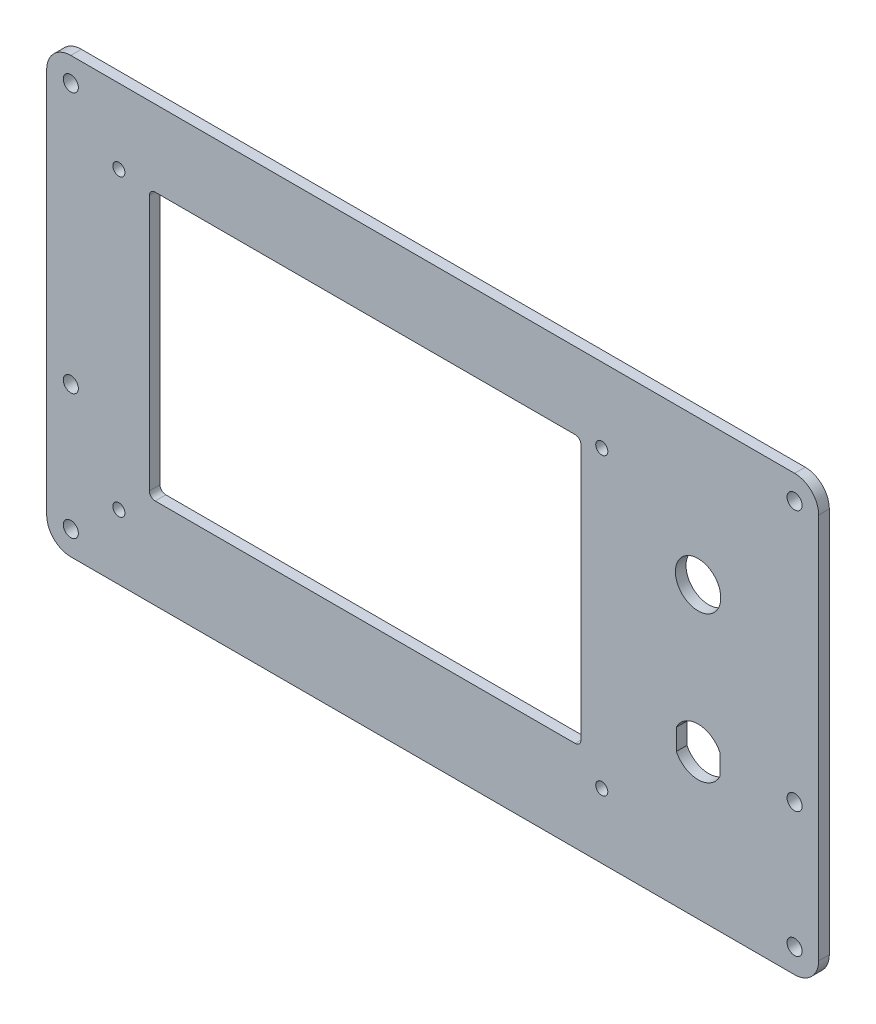
ISO-10303-21;
HEADER;
FILE_DESCRIPTION(('STEP AP214'),'2;1');
FILE_NAME('part.step','',(''),(''),'','','');
FILE_SCHEMA(('AUTOMOTIVE_DESIGN { 1 0 10303 214 1 1 1 1 }'));
ENDSEC;
DATA;
#1=APPLICATION_CONTEXT('core data for automotive mechanical design processes');
#2=APPLICATION_PROTOCOL_DEFINITION('international standard','automotive_design',2000,#1);
#3=PRODUCT_CONTEXT('',#1,'mechanical');
#4=PRODUCT('Part','Part','',(#3));
#5=PRODUCT_RELATED_PRODUCT_CATEGORY('part','',(#4));
#6=PRODUCT_DEFINITION_FORMATION('','',#4);
#7=PRODUCT_DEFINITION_CONTEXT('part definition',#1,'design');
#8=PRODUCT_DEFINITION('design','',#6,#7);
#9=PRODUCT_DEFINITION_SHAPE('','',#8);
#10=(LENGTH_UNIT() NAMED_UNIT(*) SI_UNIT(.MILLI.,.METRE.));
#11=(NAMED_UNIT(*) PLANE_ANGLE_UNIT() SI_UNIT($,.RADIAN.));
#12=(NAMED_UNIT(*) SI_UNIT($,.STERADIAN.) SOLID_ANGLE_UNIT());
#13=UNCERTAINTY_MEASURE_WITH_UNIT(LENGTH_MEASURE(1.E-05),#10,'distance_accuracy_value','');
#14=(GEOMETRIC_REPRESENTATION_CONTEXT(3) GLOBAL_UNCERTAINTY_ASSIGNED_CONTEXT((#13)) GLOBAL_UNIT_ASSIGNED_CONTEXT((#10,
#11,#12)) REPRESENTATION_CONTEXT('',''));
#15=CARTESIAN_POINT('',(0.,0.,0.));
#16=DIRECTION('',(0.,0.,1.));
#17=DIRECTION('',(1.,0.,0.));
#18=AXIS2_PLACEMENT_3D('',#15,#16,#17);
#19=CARTESIAN_POINT('',(101.6,-57.15,2.794));
#20=DIRECTION('',(-1.,0.,0.));
#21=DIRECTION('',(0.,0.,1.));
#22=AXIS2_PLACEMENT_3D('',#19,#20,#21);
#23=PLANE('',#22);
#24=DIRECTION('',(0.,1.,0.));
#25=VECTOR('',#24,1.);
#26=CARTESIAN_POINT('',(101.6,-57.15,2.794));
#27=LINE('',#26,#25);
#28=CARTESIAN_POINT('',(101.6,-50.8,2.794));
#29=VERTEX_POINT('',#28);
#30=CARTESIAN_POINT('',(101.6,50.8,2.794));
#31=VERTEX_POINT('',#30);
#32=EDGE_CURVE('E295',#29,#31,#27,.T.);
#33=ORIENTED_EDGE('',*,*,#32,.F.);
#34=DIRECTION('',(0.,0.,-1.));
#35=VECTOR('',#34,1.);
#36=CARTESIAN_POINT('',(101.6,-50.8,2.794));
#37=LINE('',#36,#35);
#38=CARTESIAN_POINT('',(101.6,-50.8,0.));
#39=VERTEX_POINT('',#38);
#40=EDGE_CURVE('E382',#29,#39,#37,.T.);
#41=ORIENTED_EDGE('',*,*,#40,.T.);
#42=DIRECTION('',(0.,1.,0.));
#43=VECTOR('',#42,1.);
#44=CARTESIAN_POINT('',(101.6,-57.15,0.));
#45=LINE('',#44,#43);
#46=CARTESIAN_POINT('',(101.6,50.8,0.));
#47=VERTEX_POINT('',#46);
#48=EDGE_CURVE('E294',#39,#47,#45,.T.);
#49=ORIENTED_EDGE('',*,*,#48,.T.);
#50=DIRECTION('',(0.,0.,-1.));
#51=VECTOR('',#50,1.);
#52=CARTESIAN_POINT('',(101.6,50.8,2.794));
#53=LINE('',#52,#51);
#54=EDGE_CURVE('E380',#47,#31,#53,.F.);
#55=ORIENTED_EDGE('',*,*,#54,.T.);
#56=EDGE_LOOP('',(#33,#41,#49,#55));
#57=FACE_BOUND('',#56,.T.);
#58=ADVANCED_FACE('F33',(#57),#23,.F.);
#59=CARTESIAN_POINT('',(-101.6,57.15,2.794));
#60=DIRECTION('',(0.,-1.,0.));
#61=DIRECTION('',(0.,0.,-1.));
#62=AXIS2_PLACEMENT_3D('',#59,#60,#61);
#63=PLANE('',#62);
#64=DIRECTION('',(-1.,0.,0.));
#65=VECTOR('',#64,1.);
#66=CARTESIAN_POINT('',(-101.6,57.15,2.794));
#67=LINE('',#66,#65);
#68=CARTESIAN_POINT('',(95.25,57.15,2.794));
#69=VERTEX_POINT('',#68);
#70=CARTESIAN_POINT('',(-95.25,57.15,2.794));
#71=VERTEX_POINT('',#70);
#72=EDGE_CURVE('E298',#69,#71,#67,.T.);
#73=ORIENTED_EDGE('',*,*,#72,.F.);
#74=DIRECTION('',(0.,0.,-1.));
#75=VECTOR('',#74,1.);
#76=CARTESIAN_POINT('',(95.25,57.15,2.794));
#77=LINE('',#76,#75);
#78=CARTESIAN_POINT('',(95.25,57.15,0.));
#79=VERTEX_POINT('',#78);
#80=EDGE_CURVE('E11',#69,#79,#77,.T.);
#81=ORIENTED_EDGE('',*,*,#80,.T.);
#82=DIRECTION('',(-1.,0.,0.));
#83=VECTOR('',#82,1.);
#84=CARTESIAN_POINT('',(-101.6,57.15,0.));
#85=LINE('',#84,#83);
#86=CARTESIAN_POINT('',(-95.25,57.15,0.));
#87=VERTEX_POINT('',#86);
#88=EDGE_CURVE('E311',#79,#87,#85,.T.);
#89=ORIENTED_EDGE('',*,*,#88,.T.);
#90=DIRECTION('',(0.,0.,-1.));
#91=VECTOR('',#90,1.);
#92=CARTESIAN_POINT('',(-95.25,57.15,2.794));
#93=LINE('',#92,#91);
#94=EDGE_CURVE('E41',#87,#71,#93,.F.);
#95=ORIENTED_EDGE('',*,*,#94,.T.);
#96=EDGE_LOOP('',(#73,#81,#89,#95));
#97=FACE_BOUND('',#96,.T.);
#98=ADVANCED_FACE('F387',(#97),#63,.F.);
#99=CARTESIAN_POINT('',(-101.6,-57.15,2.794));
#100=DIRECTION('',(1.,0.,0.));
#101=DIRECTION('',(0.,0.,-1.));
#102=AXIS2_PLACEMENT_3D('',#99,#100,#101);
#103=PLANE('',#102);
#104=DIRECTION('',(0.,-1.,0.));
#105=VECTOR('',#104,1.);
#106=CARTESIAN_POINT('',(-101.6,-57.15,0.));
#107=LINE('',#106,#105);
#108=CARTESIAN_POINT('',(-101.6,50.8,0.));
#109=VERTEX_POINT('',#108);
#110=CARTESIAN_POINT('',(-101.6,-50.8,0.));
#111=VERTEX_POINT('',#110);
#112=EDGE_CURVE('E314',#109,#111,#107,.T.);
#113=ORIENTED_EDGE('',*,*,#112,.T.);
#114=DIRECTION('',(0.,0.,-1.));
#115=VECTOR('',#114,1.);
#116=CARTESIAN_POINT('',(-101.6,-50.8,2.794));
#117=LINE('',#116,#115);
#118=CARTESIAN_POINT('',(-101.6,-50.8,2.794));
#119=VERTEX_POINT('',#118);
#120=EDGE_CURVE('E370',#111,#119,#117,.F.);
#121=ORIENTED_EDGE('',*,*,#120,.T.);
#122=DIRECTION('',(0.,-1.,0.));
#123=VECTOR('',#122,1.);
#124=CARTESIAN_POINT('',(-101.6,-57.15,2.794));
#125=LINE('',#124,#123);
#126=CARTESIAN_POINT('',(-101.6,50.8,2.794));
#127=VERTEX_POINT('',#126);
#128=EDGE_CURVE('E302',#127,#119,#125,.T.);
#129=ORIENTED_EDGE('',*,*,#128,.F.);
#130=DIRECTION('',(0.,0.,-1.));
#131=VECTOR('',#130,1.);
#132=CARTESIAN_POINT('',(-101.6,50.8,2.794));
#133=LINE('',#132,#131);
#134=EDGE_CURVE('E367',#127,#109,#133,.T.);
#135=ORIENTED_EDGE('',*,*,#134,.T.);
#136=EDGE_LOOP('',(#113,#121,#129,#135));
#137=FACE_BOUND('',#136,.T.);
#138=ADVANCED_FACE('F399',(#137),#103,.F.);
#139=CARTESIAN_POINT('',(-101.6,-57.15,2.794));
#140=DIRECTION('',(0.,1.,0.));
#141=DIRECTION('',(0.,0.,1.));
#142=AXIS2_PLACEMENT_3D('',#139,#140,#141);
#143=PLANE('',#142);
#144=DIRECTION('',(1.,0.,0.));
#145=VECTOR('',#144,1.);
#146=CARTESIAN_POINT('',(-101.6,-57.15,2.794));
#147=LINE('',#146,#145);
#148=CARTESIAN_POINT('',(-95.25,-57.15,2.794));
#149=VERTEX_POINT('',#148);
#150=CARTESIAN_POINT('',(95.25,-57.15,2.794));
#151=VERTEX_POINT('',#150);
#152=EDGE_CURVE('E305',#149,#151,#147,.T.);
#153=ORIENTED_EDGE('',*,*,#152,.F.);
#154=DIRECTION('',(0.,0.,-1.));
#155=VECTOR('',#154,1.);
#156=CARTESIAN_POINT('',(-95.25,-57.15,2.794));
#157=LINE('',#156,#155);
#158=CARTESIAN_POINT('',(-95.25,-57.15,0.));
#159=VERTEX_POINT('',#158);
#160=EDGE_CURVE('E356',#149,#159,#157,.T.);
#161=ORIENTED_EDGE('',*,*,#160,.T.);
#162=DIRECTION('',(1.,0.,0.));
#163=VECTOR('',#162,1.);
#164=CARTESIAN_POINT('',(-101.6,-57.15,0.));
#165=LINE('',#164,#163);
#166=CARTESIAN_POINT('',(95.25,-57.15,0.));
#167=VERTEX_POINT('',#166);
#168=EDGE_CURVE('E299',#159,#167,#165,.T.);
#169=ORIENTED_EDGE('',*,*,#168,.T.);
#170=DIRECTION('',(0.,0.,-1.));
#171=VECTOR('',#170,1.);
#172=CARTESIAN_POINT('',(95.25,-57.15,2.794));
#173=LINE('',#172,#171);
#174=EDGE_CURVE('E354',#167,#151,#173,.F.);
#175=ORIENTED_EDGE('',*,*,#174,.T.);
#176=EDGE_LOOP('',(#153,#161,#169,#175));
#177=FACE_BOUND('',#176,.T.);
#178=ADVANCED_FACE('F409',(#177),#143,.F.);
#179=CARTESIAN_POINT('',(0.,0.,2.794));
#180=DIRECTION('',(0.,0.,-1.));
#181=DIRECTION('',(-1.,0.,0.));
#182=AXIS2_PLACEMENT_3D('',#179,#180,#181);
#183=PLANE('',#182);
#184=CARTESIAN_POINT('',(69.85,19.05,2.794));
#185=DIRECTION('',(0.,0.,1.));
#186=DIRECTION('',(1.,0.,0.));
#187=AXIS2_PLACEMENT_3D('',#184,#185,#186);
#188=CIRCLE('',#187,5.96900000000001);
#189=CARTESIAN_POINT('',(75.819,19.05,2.794));
#190=VERTEX_POINT('',#189);
#191=EDGE_CURVE('E194',#190,#190,#188,.T.);
#192=ORIENTED_EDGE('',*,*,#191,.F.);
#193=EDGE_LOOP('',(#192));
#194=FACE_BOUND('',#193,.T.);
#195=DIRECTION('',(0.,1.,0.));
#196=VECTOR('',#195,1.);
#197=CARTESIAN_POINT('',(75.565,-21.8179008291483,2.794));
#198=LINE('',#197,#196);
#199=CARTESIAN_POINT('',(75.565,-21.8179008291483,2.794));
#200=VERTEX_POINT('',#199);
#201=CARTESIAN_POINT('',(75.565,-16.2820991708517,2.794));
#202=VERTEX_POINT('',#201);
#203=EDGE_CURVE('E200',#200,#202,#198,.T.);
#204=ORIENTED_EDGE('',*,*,#203,.F.);
#205=CARTESIAN_POINT('',(69.85,-19.05,2.794));
#206=DIRECTION('',(0.,0.,1.));
#207=DIRECTION('',(1.,0.,0.));
#208=AXIS2_PLACEMENT_3D('',#205,#206,#207);
#209=CIRCLE('',#208,6.35);
#210=CARTESIAN_POINT('',(64.135,-21.8179008291483,2.794));
#211=VERTEX_POINT('',#210);
#212=EDGE_CURVE('E48',#211,#200,#209,.T.);
#213=ORIENTED_EDGE('',*,*,#212,.F.);
#214=DIRECTION('',(0.,-1.,0.));
#215=VECTOR('',#214,1.);
#216=CARTESIAN_POINT('',(64.135,-21.8179008291483,2.794));
#217=LINE('',#216,#215);
#218=CARTESIAN_POINT('',(64.135,-16.2820991708517,2.794));
#219=VERTEX_POINT('',#218);
#220=EDGE_CURVE('E188',#219,#211,#217,.T.);
#221=ORIENTED_EDGE('',*,*,#220,.F.);
#222=CARTESIAN_POINT('',(69.85,-19.05,2.794));
#223=DIRECTION('',(0.,0.,1.));
#224=DIRECTION('',(1.,0.,0.));
#225=AXIS2_PLACEMENT_3D('',#222,#223,#224);
#226=CIRCLE('',#225,6.35);
#227=EDGE_CURVE('E191',#202,#219,#226,.T.);
#228=ORIENTED_EDGE('',*,*,#227,.F.);
#229=EDGE_LOOP('',(#204,#213,#221,#228));
#230=FACE_BOUND('',#229,.T.);
#231=DIRECTION('',(-1.,0.,0.));
#232=VECTOR('',#231,1.);
#233=CARTESIAN_POINT('',(-74.57399995,37.084,2.794));
#234=LINE('',#233,#232);
#235=CARTESIAN_POINT('',(37.48999995,37.084,2.794));
#236=VERTEX_POINT('',#235);
#237=CARTESIAN_POINT('',(-73.04999995,37.084,2.794));
#238=VERTEX_POINT('',#237);
#239=EDGE_CURVE('E226',#236,#238,#234,.T.);
#240=ORIENTED_EDGE('',*,*,#239,.F.);
#241=CARTESIAN_POINT('',(37.48999995,35.56,2.794));
#242=DIRECTION('',(0.,0.,-1.));
#243=DIRECTION('',(-1.,0.,0.));
#244=AXIS2_PLACEMENT_3D('',#241,#242,#243);
#245=CIRCLE('',#244,1.524);
#246=CARTESIAN_POINT('',(39.01399995,35.56,2.794));
#247=VERTEX_POINT('',#246);
#248=EDGE_CURVE('E346',#236,#247,#245,.T.);
#249=ORIENTED_EDGE('',*,*,#248,.T.);
#250=DIRECTION('',(0.,1.,0.));
#251=VECTOR('',#250,1.);
#252=CARTESIAN_POINT('',(39.01399995,-33.30399994,2.794));
#253=LINE('',#252,#251);
#254=CARTESIAN_POINT('',(39.01399995,-31.77999994,2.794));
#255=VERTEX_POINT('',#254);
#256=EDGE_CURVE('E223',#255,#247,#253,.T.);
#257=ORIENTED_EDGE('',*,*,#256,.F.);
#258=CARTESIAN_POINT('',(37.48999995,-31.77999994,2.794));
#259=DIRECTION('',(0.,0.,-1.));
#260=DIRECTION('',(-1.,0.,0.));
#261=AXIS2_PLACEMENT_3D('',#258,#259,#260);
#262=CIRCLE('',#261,1.524);
#263=CARTESIAN_POINT('',(37.48999995,-33.30399994,2.794));
#264=VERTEX_POINT('',#263);
#265=EDGE_CURVE('E342',#255,#264,#262,.T.);
#266=ORIENTED_EDGE('',*,*,#265,.T.);
#267=DIRECTION('',(1.,0.,0.));
#268=VECTOR('',#267,1.);
#269=CARTESIAN_POINT('',(-74.57399995,-33.30399994,2.794));
#270=LINE('',#269,#268);
#271=CARTESIAN_POINT('',(-73.04999995,-33.30399994,2.794));
#272=VERTEX_POINT('',#271);
#273=EDGE_CURVE('E213',#272,#264,#270,.T.);
#274=ORIENTED_EDGE('',*,*,#273,.F.);
#275=CARTESIAN_POINT('',(-73.04999995,-31.77999994,2.794));
#276=DIRECTION('',(0.,0.,-1.));
#277=DIRECTION('',(-1.,0.,0.));
#278=AXIS2_PLACEMENT_3D('',#275,#276,#277);
#279=CIRCLE('',#278,1.524);
#280=CARTESIAN_POINT('',(-74.57399995,-31.77999994,2.794));
#281=VERTEX_POINT('',#280);
#282=EDGE_CURVE('E338',#272,#281,#279,.T.);
#283=ORIENTED_EDGE('',*,*,#282,.T.);
#284=DIRECTION('',(0.,-1.,0.));
#285=VECTOR('',#284,1.);
#286=CARTESIAN_POINT('',(-74.57399995,-33.30399994,2.794));
#287=LINE('',#286,#285);
#288=CARTESIAN_POINT('',(-74.57399995,35.56,2.794));
#289=VERTEX_POINT('',#288);
#290=EDGE_CURVE('E230',#289,#281,#287,.T.);
#291=ORIENTED_EDGE('',*,*,#290,.F.);
#292=CARTESIAN_POINT('',(-73.04999995,35.56,2.794));
#293=DIRECTION('',(0.,0.,-1.));
#294=DIRECTION('',(-1.,0.,0.));
#295=AXIS2_PLACEMENT_3D('',#292,#293,#294);
#296=CIRCLE('',#295,1.524);
#297=EDGE_CURVE('E350',#289,#238,#296,.T.);
#298=ORIENTED_EDGE('',*,*,#297,.T.);
#299=EDGE_LOOP('',(#240,#249,#257,#266,#274,#283,#291,#298));
#300=FACE_BOUND('',#299,.T.);
#301=CARTESIAN_POINT('',(-95.25,50.8,2.794));
#302=DIRECTION('',(0.,0.,1.));
#303=DIRECTION('',(1.,0.,0.));
#304=AXIS2_PLACEMENT_3D('',#301,#302,#303);
#305=CIRCLE('',#304,1.984375);
#306=CARTESIAN_POINT('',(-93.265625,50.8,2.794));
#307=VERTEX_POINT('',#306);
#308=EDGE_CURVE('E222',#307,#307,#305,.T.);
#309=ORIENTED_EDGE('',*,*,#308,.F.);
#310=EDGE_LOOP('',(#309));
#311=FACE_BOUND('',#310,.T.);
#312=CARTESIAN_POINT('',(95.25,50.8,2.794));
#313=DIRECTION('',(0.,0.,1.));
#314=DIRECTION('',(1.,0.,0.));
#315=AXIS2_PLACEMENT_3D('',#312,#313,#314);
#316=CIRCLE('',#315,1.984375);
#317=CARTESIAN_POINT('',(97.234375,50.8,2.794));
#318=VERTEX_POINT('',#317);
#319=EDGE_CURVE('E240',#318,#318,#316,.T.);
#320=ORIENTED_EDGE('',*,*,#319,.F.);
#321=EDGE_LOOP('',(#320));
#322=FACE_BOUND('',#321,.T.);
#323=CARTESIAN_POINT('',(95.25,-50.8,2.794));
#324=DIRECTION('',(0.,0.,1.));
#325=DIRECTION('',(1.,0.,0.));
#326=AXIS2_PLACEMENT_3D('',#323,#324,#325);
#327=CIRCLE('',#326,1.984375);
#328=CARTESIAN_POINT('',(97.234375,-50.8,2.794));
#329=VERTEX_POINT('',#328);
#330=EDGE_CURVE('E246',#329,#329,#327,.T.);
#331=ORIENTED_EDGE('',*,*,#330,.F.);
#332=EDGE_LOOP('',(#331));
#333=FACE_BOUND('',#332,.T.);
#334=CARTESIAN_POINT('',(-95.25,-50.8,2.794));
#335=DIRECTION('',(0.,0.,1.));
#336=DIRECTION('',(1.,0.,0.));
#337=AXIS2_PLACEMENT_3D('',#334,#335,#336);
#338=CIRCLE('',#337,1.984375);
#339=CARTESIAN_POINT('',(-93.265625,-50.8,2.794));
#340=VERTEX_POINT('',#339);
#341=EDGE_CURVE('E252',#340,#340,#338,.T.);
#342=ORIENTED_EDGE('',*,*,#341,.F.);
#343=EDGE_LOOP('',(#342));
#344=FACE_BOUND('',#343,.T.);
#345=CARTESIAN_POINT('',(-95.25,-17.78,2.794));
#346=DIRECTION('',(0.,0.,1.));
#347=DIRECTION('',(1.,0.,0.));
#348=AXIS2_PLACEMENT_3D('',#345,#346,#347);
#349=CIRCLE('',#348,1.984375);
#350=CARTESIAN_POINT('',(-93.265625,-17.78,2.794));
#351=VERTEX_POINT('',#350);
#352=EDGE_CURVE('E258',#351,#351,#349,.T.);
#353=ORIENTED_EDGE('',*,*,#352,.F.);
#354=EDGE_LOOP('',(#353));
#355=FACE_BOUND('',#354,.T.);
#356=CARTESIAN_POINT('',(95.25,-17.78,2.794));
#357=DIRECTION('',(0.,0.,1.));
#358=DIRECTION('',(1.,0.,0.));
#359=AXIS2_PLACEMENT_3D('',#356,#357,#358);
#360=CIRCLE('',#359,1.984375);
#361=CARTESIAN_POINT('',(97.234375,-17.78,2.794));
#362=VERTEX_POINT('',#361);
#363=EDGE_CURVE('E264',#362,#362,#360,.T.);
#364=ORIENTED_EDGE('',*,*,#363,.F.);
#365=EDGE_LOOP('',(#364));
#366=FACE_BOUND('',#365,.T.);
#367=CARTESIAN_POINT('',(-82.6,-40.07,2.794));
#368=DIRECTION('',(0.,0.,1.));
#369=DIRECTION('',(1.,0.,0.));
#370=AXIS2_PLACEMENT_3D('',#367,#368,#369);
#371=CIRCLE('',#370,1.58749999999999);
#372=CARTESIAN_POINT('',(-81.0125,-40.07,2.794));
#373=VERTEX_POINT('',#372);
#374=EDGE_CURVE('E270',#373,#373,#371,.T.);
#375=ORIENTED_EDGE('',*,*,#374,.F.);
#376=EDGE_LOOP('',(#375));
#377=FACE_BOUND('',#376,.T.);
#378=CARTESIAN_POINT('',(-82.6,37.53,2.794));
#379=DIRECTION('',(0.,0.,1.));
#380=DIRECTION('',(1.,0.,0.));
#381=AXIS2_PLACEMENT_3D('',#378,#379,#380);
#382=CIRCLE('',#381,1.58749999999999);
#383=CARTESIAN_POINT('',(-81.0125,37.53,2.794));
#384=VERTEX_POINT('',#383);
#385=EDGE_CURVE('E276',#384,#384,#382,.T.);
#386=ORIENTED_EDGE('',*,*,#385,.F.);
#387=EDGE_LOOP('',(#386));
#388=FACE_BOUND('',#387,.T.);
#389=CARTESIAN_POINT('',(44.5,-40.07,2.794));
#390=DIRECTION('',(0.,0.,1.));
#391=DIRECTION('',(1.,0.,0.));
#392=AXIS2_PLACEMENT_3D('',#389,#390,#391);
#393=CIRCLE('',#392,1.5875);
#394=CARTESIAN_POINT('',(46.0875,-40.07,2.794));
#395=VERTEX_POINT('',#394);
#396=EDGE_CURVE('E282',#395,#395,#393,.T.);
#397=ORIENTED_EDGE('',*,*,#396,.F.);
#398=EDGE_LOOP('',(#397));
#399=FACE_BOUND('',#398,.T.);
#400=CARTESIAN_POINT('',(44.5,37.53,2.794));
#401=DIRECTION('',(0.,0.,1.));
#402=DIRECTION('',(1.,0.,0.));
#403=AXIS2_PLACEMENT_3D('',#400,#401,#402);
#404=CIRCLE('',#403,1.5875);
#405=CARTESIAN_POINT('',(46.0875,37.53,2.794));
#406=VERTEX_POINT('',#405);
#407=EDGE_CURVE('E288',#406,#406,#404,.T.);
#408=ORIENTED_EDGE('',*,*,#407,.F.);
#409=EDGE_LOOP('',(#408));
#410=FACE_BOUND('',#409,.T.);
#411=ORIENTED_EDGE('',*,*,#128,.T.);
#412=CARTESIAN_POINT('',(-95.25,-50.8,2.794));
#413=DIRECTION('',(0.,0.,-1.));
#414=DIRECTION('',(-1.,0.,0.));
#415=AXIS2_PLACEMENT_3D('',#412,#413,#414);
#416=CIRCLE('',#415,6.35);
#417=EDGE_CURVE('E378',#119,#149,#416,.F.);
#418=ORIENTED_EDGE('',*,*,#417,.T.);
#419=ORIENTED_EDGE('',*,*,#152,.T.);
#420=CARTESIAN_POINT('',(95.25,-50.8,2.794));
#421=DIRECTION('',(0.,0.,-1.));
#422=DIRECTION('',(-1.,0.,0.));
#423=AXIS2_PLACEMENT_3D('',#420,#421,#422);
#424=CIRCLE('',#423,6.35);
#425=EDGE_CURVE('E376',#151,#29,#424,.F.);
#426=ORIENTED_EDGE('',*,*,#425,.T.);
#427=ORIENTED_EDGE('',*,*,#32,.T.);
#428=CARTESIAN_POINT('',(95.25,50.8,2.794));
#429=DIRECTION('',(0.,0.,-1.));
#430=DIRECTION('',(-1.,0.,0.));
#431=AXIS2_PLACEMENT_3D('',#428,#429,#430);
#432=CIRCLE('',#431,6.35);
#433=EDGE_CURVE('E374',#31,#69,#432,.F.);
#434=ORIENTED_EDGE('',*,*,#433,.T.);
#435=ORIENTED_EDGE('',*,*,#72,.T.);
#436=CARTESIAN_POINT('',(-95.25,50.8,2.794));
#437=DIRECTION('',(0.,0.,-1.));
#438=DIRECTION('',(-1.,0.,0.));
#439=AXIS2_PLACEMENT_3D('',#436,#437,#438);
#440=CIRCLE('',#439,6.35);
#441=EDGE_CURVE('E372',#71,#127,#440,.F.);
#442=ORIENTED_EDGE('',*,*,#441,.T.);
#443=EDGE_LOOP('',(#411,#418,#419,#426,#427,#434,#435,#442));
#444=FACE_BOUND('',#443,.T.);
#445=ADVANCED_FACE('F393',(#194,#230,#300,#311,#322,#333,#344,#355,#366,#377,#388,#399,#410,
#444),#183,.F.);
#446=CARTESIAN_POINT('',(0.,0.,0.));
#447=DIRECTION('',(0.,0.,-1.));
#448=DIRECTION('',(-1.,0.,0.));
#449=AXIS2_PLACEMENT_3D('',#446,#447,#448);
#450=PLANE('',#449);
#451=CARTESIAN_POINT('',(69.85,19.05,0.));
#452=DIRECTION('',(0.,0.,1.));
#453=DIRECTION('',(1.,0.,0.));
#454=AXIS2_PLACEMENT_3D('',#451,#452,#453);
#455=CIRCLE('',#454,5.96900000000001);
#456=CARTESIAN_POINT('',(75.819,19.05,0.));
#457=VERTEX_POINT('',#456);
#458=EDGE_CURVE('E227',#457,#457,#455,.T.);
#459=ORIENTED_EDGE('',*,*,#458,.T.);
#460=EDGE_LOOP('',(#459));
#461=FACE_BOUND('',#460,.T.);
#462=CARTESIAN_POINT('',(69.85,-19.05,0.));
#463=DIRECTION('',(0.,0.,1.));
#464=DIRECTION('',(1.,0.,0.));
#465=AXIS2_PLACEMENT_3D('',#462,#463,#464);
#466=CIRCLE('',#465,6.35);
#467=CARTESIAN_POINT('',(64.135,-21.8179008291483,0.));
#468=VERTEX_POINT('',#467);
#469=CARTESIAN_POINT('',(75.565,-21.8179008291483,0.));
#470=VERTEX_POINT('',#469);
#471=EDGE_CURVE('E172',#468,#470,#466,.T.);
#472=ORIENTED_EDGE('',*,*,#471,.T.);
#473=DIRECTION('',(0.,1.,0.));
#474=VECTOR('',#473,1.);
#475=CARTESIAN_POINT('',(75.565,-21.8179008291483,0.));
#476=LINE('',#475,#474);
#477=CARTESIAN_POINT('',(75.565,-16.2820991708517,0.));
#478=VERTEX_POINT('',#477);
#479=EDGE_CURVE('E181',#470,#478,#476,.T.);
#480=ORIENTED_EDGE('',*,*,#479,.T.);
#481=CARTESIAN_POINT('',(69.85,-19.05,0.));
#482=DIRECTION('',(0.,0.,1.));
#483=DIRECTION('',(1.,0.,0.));
#484=AXIS2_PLACEMENT_3D('',#481,#482,#483);
#485=CIRCLE('',#484,6.35);
#486=CARTESIAN_POINT('',(64.135,-16.2820991708517,0.));
#487=VERTEX_POINT('',#486);
#488=EDGE_CURVE('E56',#478,#487,#485,.T.);
#489=ORIENTED_EDGE('',*,*,#488,.T.);
#490=DIRECTION('',(0.,-1.,0.));
#491=VECTOR('',#490,1.);
#492=CARTESIAN_POINT('',(64.135,-21.8179008291483,0.));
#493=LINE('',#492,#491);
#494=EDGE_CURVE('E178',#487,#468,#493,.T.);
#495=ORIENTED_EDGE('',*,*,#494,.T.);
#496=EDGE_LOOP('',(#472,#480,#489,#495));
#497=FACE_BOUND('',#496,.T.);
#498=DIRECTION('',(1.,0.,0.));
#499=VECTOR('',#498,1.);
#500=CARTESIAN_POINT('',(-74.57399995,-33.30399994,0.));
#501=LINE('',#500,#499);
#502=CARTESIAN_POINT('',(-73.04999995,-33.30399994,0.));
#503=VERTEX_POINT('',#502);
#504=CARTESIAN_POINT('',(37.48999995,-33.30399994,0.));
#505=VERTEX_POINT('',#504);
#506=EDGE_CURVE('E219',#503,#505,#501,.T.);
#507=ORIENTED_EDGE('',*,*,#506,.T.);
#508=CARTESIAN_POINT('',(37.48999995,-31.77999994,0.));
#509=DIRECTION('',(0.,0.,-1.));
#510=DIRECTION('',(-1.,0.,0.));
#511=AXIS2_PLACEMENT_3D('',#508,#509,#510);
#512=CIRCLE('',#511,1.524);
#513=CARTESIAN_POINT('',(39.01399995,-31.77999994,0.));
#514=VERTEX_POINT('',#513);
#515=EDGE_CURVE('E344',#505,#514,#512,.F.);
#516=ORIENTED_EDGE('',*,*,#515,.T.);
#517=DIRECTION('',(0.,1.,0.));
#518=VECTOR('',#517,1.);
#519=CARTESIAN_POINT('',(39.01399995,-33.30399994,0.));
#520=LINE('',#519,#518);
#521=CARTESIAN_POINT('',(39.01399995,35.56,0.));
#522=VERTEX_POINT('',#521);
#523=EDGE_CURVE('E209',#514,#522,#520,.T.);
#524=ORIENTED_EDGE('',*,*,#523,.T.);
#525=CARTESIAN_POINT('',(37.48999995,35.56,0.));
#526=DIRECTION('',(0.,0.,-1.));
#527=DIRECTION('',(-1.,0.,0.));
#528=AXIS2_PLACEMENT_3D('',#525,#526,#527);
#529=CIRCLE('',#528,1.524);
#530=CARTESIAN_POINT('',(37.48999995,37.084,0.));
#531=VERTEX_POINT('',#530);
#532=EDGE_CURVE('E348',#522,#531,#529,.F.);
#533=ORIENTED_EDGE('',*,*,#532,.T.);
#534=DIRECTION('',(-1.,0.,0.));
#535=VECTOR('',#534,1.);
#536=CARTESIAN_POINT('',(-74.57399995,37.084,0.));
#537=LINE('',#536,#535);
#538=CARTESIAN_POINT('',(-73.04999995,37.084,0.));
#539=VERTEX_POINT('',#538);
#540=EDGE_CURVE('E212',#531,#539,#537,.T.);
#541=ORIENTED_EDGE('',*,*,#540,.T.);
#542=CARTESIAN_POINT('',(-73.04999995,35.56,0.));
#543=DIRECTION('',(0.,0.,-1.));
#544=DIRECTION('',(-1.,0.,0.));
#545=AXIS2_PLACEMENT_3D('',#542,#543,#544);
#546=CIRCLE('',#545,1.524);
#547=CARTESIAN_POINT('',(-74.57399995,35.56,0.));
#548=VERTEX_POINT('',#547);
#549=EDGE_CURVE('E352',#539,#548,#546,.F.);
#550=ORIENTED_EDGE('',*,*,#549,.T.);
#551=DIRECTION('',(0.,-1.,0.));
#552=VECTOR('',#551,1.);
#553=CARTESIAN_POINT('',(-74.57399995,-33.30399994,0.));
#554=LINE('',#553,#552);
#555=CARTESIAN_POINT('',(-74.57399995,-31.77999994,0.));
#556=VERTEX_POINT('',#555);
#557=EDGE_CURVE('E216',#548,#556,#554,.T.);
#558=ORIENTED_EDGE('',*,*,#557,.T.);
#559=CARTESIAN_POINT('',(-73.04999995,-31.77999994,0.));
#560=DIRECTION('',(0.,0.,-1.));
#561=DIRECTION('',(-1.,0.,0.));
#562=AXIS2_PLACEMENT_3D('',#559,#560,#561);
#563=CIRCLE('',#562,1.524);
#564=EDGE_CURVE('E340',#556,#503,#563,.F.);
#565=ORIENTED_EDGE('',*,*,#564,.T.);
#566=EDGE_LOOP('',(#507,#516,#524,#533,#541,#550,#558,#565));
#567=FACE_BOUND('',#566,.T.);
#568=CARTESIAN_POINT('',(-95.25,50.8,0.));
#569=DIRECTION('',(0.,0.,1.));
#570=DIRECTION('',(1.,0.,0.));
#571=AXIS2_PLACEMENT_3D('',#568,#569,#570);
#572=CIRCLE('',#571,1.984375);
#573=CARTESIAN_POINT('',(-93.265625,50.8,0.));
#574=VERTEX_POINT('',#573);
#575=EDGE_CURVE('E237',#574,#574,#572,.T.);
#576=ORIENTED_EDGE('',*,*,#575,.T.);
#577=EDGE_LOOP('',(#576));
#578=FACE_BOUND('',#577,.T.);
#579=CARTESIAN_POINT('',(95.25,50.8,0.));
#580=DIRECTION('',(0.,0.,1.));
#581=DIRECTION('',(1.,0.,0.));
#582=AXIS2_PLACEMENT_3D('',#579,#580,#581);
#583=CIRCLE('',#582,1.984375);
#584=CARTESIAN_POINT('',(97.234375,50.8,0.));
#585=VERTEX_POINT('',#584);
#586=EDGE_CURVE('E243',#585,#585,#583,.T.);
#587=ORIENTED_EDGE('',*,*,#586,.T.);
#588=EDGE_LOOP('',(#587));
#589=FACE_BOUND('',#588,.T.);
#590=CARTESIAN_POINT('',(95.25,-50.8,0.));
#591=DIRECTION('',(0.,0.,1.));
#592=DIRECTION('',(1.,0.,0.));
#593=AXIS2_PLACEMENT_3D('',#590,#591,#592);
#594=CIRCLE('',#593,1.984375);
#595=CARTESIAN_POINT('',(97.234375,-50.8,0.));
#596=VERTEX_POINT('',#595);
#597=EDGE_CURVE('E249',#596,#596,#594,.T.);
#598=ORIENTED_EDGE('',*,*,#597,.T.);
#599=EDGE_LOOP('',(#598));
#600=FACE_BOUND('',#599,.T.);
#601=CARTESIAN_POINT('',(-95.25,-50.8,0.));
#602=DIRECTION('',(0.,0.,1.));
#603=DIRECTION('',(1.,0.,0.));
#604=AXIS2_PLACEMENT_3D('',#601,#602,#603);
#605=CIRCLE('',#604,1.984375);
#606=CARTESIAN_POINT('',(-93.265625,-50.8,0.));
#607=VERTEX_POINT('',#606);
#608=EDGE_CURVE('E255',#607,#607,#605,.T.);
#609=ORIENTED_EDGE('',*,*,#608,.T.);
#610=EDGE_LOOP('',(#609));
#611=FACE_BOUND('',#610,.T.);
#612=CARTESIAN_POINT('',(-95.25,-17.78,0.));
#613=DIRECTION('',(0.,0.,1.));
#614=DIRECTION('',(1.,0.,0.));
#615=AXIS2_PLACEMENT_3D('',#612,#613,#614);
#616=CIRCLE('',#615,1.984375);
#617=CARTESIAN_POINT('',(-93.265625,-17.78,0.));
#618=VERTEX_POINT('',#617);
#619=EDGE_CURVE('E261',#618,#618,#616,.T.);
#620=ORIENTED_EDGE('',*,*,#619,.T.);
#621=EDGE_LOOP('',(#620));
#622=FACE_BOUND('',#621,.T.);
#623=CARTESIAN_POINT('',(95.25,-17.78,0.));
#624=DIRECTION('',(0.,0.,1.));
#625=DIRECTION('',(1.,0.,0.));
#626=AXIS2_PLACEMENT_3D('',#623,#624,#625);
#627=CIRCLE('',#626,1.984375);
#628=CARTESIAN_POINT('',(97.234375,-17.78,0.));
#629=VERTEX_POINT('',#628);
#630=EDGE_CURVE('E267',#629,#629,#627,.T.);
#631=ORIENTED_EDGE('',*,*,#630,.T.);
#632=EDGE_LOOP('',(#631));
#633=FACE_BOUND('',#632,.T.);
#634=CARTESIAN_POINT('',(-82.6,-40.07,0.));
#635=DIRECTION('',(0.,0.,1.));
#636=DIRECTION('',(1.,0.,0.));
#637=AXIS2_PLACEMENT_3D('',#634,#635,#636);
#638=CIRCLE('',#637,1.58749999999999);
#639=CARTESIAN_POINT('',(-81.0125,-40.07,0.));
#640=VERTEX_POINT('',#639);
#641=EDGE_CURVE('E273',#640,#640,#638,.T.);
#642=ORIENTED_EDGE('',*,*,#641,.T.);
#643=EDGE_LOOP('',(#642));
#644=FACE_BOUND('',#643,.T.);
#645=CARTESIAN_POINT('',(-82.6,37.53,0.));
#646=DIRECTION('',(0.,0.,1.));
#647=DIRECTION('',(1.,0.,0.));
#648=AXIS2_PLACEMENT_3D('',#645,#646,#647);
#649=CIRCLE('',#648,1.58749999999999);
#650=CARTESIAN_POINT('',(-81.0125,37.53,0.));
#651=VERTEX_POINT('',#650);
#652=EDGE_CURVE('E279',#651,#651,#649,.T.);
#653=ORIENTED_EDGE('',*,*,#652,.T.);
#654=EDGE_LOOP('',(#653));
#655=FACE_BOUND('',#654,.T.);
#656=CARTESIAN_POINT('',(44.5,-40.07,0.));
#657=DIRECTION('',(0.,0.,1.));
#658=DIRECTION('',(1.,0.,0.));
#659=AXIS2_PLACEMENT_3D('',#656,#657,#658);
#660=CIRCLE('',#659,1.5875);
#661=CARTESIAN_POINT('',(46.0875,-40.07,0.));
#662=VERTEX_POINT('',#661);
#663=EDGE_CURVE('E285',#662,#662,#660,.T.);
#664=ORIENTED_EDGE('',*,*,#663,.T.);
#665=EDGE_LOOP('',(#664));
#666=FACE_BOUND('',#665,.T.);
#667=CARTESIAN_POINT('',(44.5,37.53,0.));
#668=DIRECTION('',(0.,0.,1.));
#669=DIRECTION('',(1.,0.,0.));
#670=AXIS2_PLACEMENT_3D('',#667,#668,#669);
#671=CIRCLE('',#670,1.5875);
#672=CARTESIAN_POINT('',(46.0875,37.53,0.));
#673=VERTEX_POINT('',#672);
#674=EDGE_CURVE('E291',#673,#673,#671,.T.);
#675=ORIENTED_EDGE('',*,*,#674,.T.);
#676=EDGE_LOOP('',(#675));
#677=FACE_BOUND('',#676,.T.);
#678=ORIENTED_EDGE('',*,*,#168,.F.);
#679=CARTESIAN_POINT('',(-95.25,-50.8,0.));
#680=DIRECTION('',(0.,0.,-1.));
#681=DIRECTION('',(-1.,0.,0.));
#682=AXIS2_PLACEMENT_3D('',#679,#680,#681);
#683=CIRCLE('',#682,6.35);
#684=EDGE_CURVE('E365',#159,#111,#683,.T.);
#685=ORIENTED_EDGE('',*,*,#684,.T.);
#686=ORIENTED_EDGE('',*,*,#112,.F.);
#687=CARTESIAN_POINT('',(-95.25,50.8,0.));
#688=DIRECTION('',(0.,0.,-1.));
#689=DIRECTION('',(-1.,0.,0.));
#690=AXIS2_PLACEMENT_3D('',#687,#688,#689);
#691=CIRCLE('',#690,6.35);
#692=EDGE_CURVE('E359',#109,#87,#691,.T.);
#693=ORIENTED_EDGE('',*,*,#692,.T.);
#694=ORIENTED_EDGE('',*,*,#88,.F.);
#695=CARTESIAN_POINT('',(95.25,50.8,0.));
#696=DIRECTION('',(0.,0.,-1.));
#697=DIRECTION('',(-1.,0.,0.));
#698=AXIS2_PLACEMENT_3D('',#695,#696,#697);
#699=CIRCLE('',#698,6.35);
#700=EDGE_CURVE('E361',#79,#47,#699,.T.);
#701=ORIENTED_EDGE('',*,*,#700,.T.);
#702=ORIENTED_EDGE('',*,*,#48,.F.);
#703=CARTESIAN_POINT('',(95.25,-50.8,0.));
#704=DIRECTION('',(0.,0.,-1.));
#705=DIRECTION('',(-1.,0.,0.));
#706=AXIS2_PLACEMENT_3D('',#703,#704,#705);
#707=CIRCLE('',#706,6.35);
#708=EDGE_CURVE('E363',#39,#167,#707,.T.);
#709=ORIENTED_EDGE('',*,*,#708,.T.);
#710=EDGE_LOOP('',(#678,#685,#686,#693,#694,#701,#702,#709));
#711=FACE_BOUND('',#710,.T.);
#712=ADVANCED_FACE('F185',(#461,#497,#567,#578,#589,#600,#611,#622,#633,#644,#655,#666,#677,
#711),#450,.T.);
#713=CARTESIAN_POINT('',(44.5,37.53,2.794));
#714=DIRECTION('',(0.,0.,1.));
#715=DIRECTION('',(1.,0.,0.));
#716=AXIS2_PLACEMENT_3D('',#713,#714,#715);
#717=CYLINDRICAL_SURFACE('',#716,1.5875);
#718=ORIENTED_EDGE('',*,*,#674,.F.);
#719=EDGE_LOOP('',(#718));
#720=FACE_BOUND('',#719,.T.);
#721=ORIENTED_EDGE('',*,*,#407,.T.);
#722=EDGE_LOOP('',(#721));
#723=FACE_BOUND('',#722,.T.);
#724=ADVANCED_FACE('F494',(#720,#723),#717,.F.);
#725=CARTESIAN_POINT('',(44.5,-40.07,2.794));
#726=DIRECTION('',(0.,0.,1.));
#727=DIRECTION('',(1.,0.,0.));
#728=AXIS2_PLACEMENT_3D('',#725,#726,#727);
#729=CYLINDRICAL_SURFACE('',#728,1.5875);
#730=ORIENTED_EDGE('',*,*,#663,.F.);
#731=EDGE_LOOP('',(#730));
#732=FACE_BOUND('',#731,.T.);
#733=ORIENTED_EDGE('',*,*,#396,.T.);
#734=EDGE_LOOP('',(#733));
#735=FACE_BOUND('',#734,.T.);
#736=ADVANCED_FACE('F593',(#732,#735),#729,.F.);
#737=CARTESIAN_POINT('',(-82.6,37.53,2.794));
#738=DIRECTION('',(0.,0.,1.));
#739=DIRECTION('',(1.,0.,0.));
#740=AXIS2_PLACEMENT_3D('',#737,#738,#739);
#741=CYLINDRICAL_SURFACE('',#740,1.58749999999999);
#742=ORIENTED_EDGE('',*,*,#652,.F.);
#743=EDGE_LOOP('',(#742));
#744=FACE_BOUND('',#743,.T.);
#745=ORIENTED_EDGE('',*,*,#385,.T.);
#746=EDGE_LOOP('',(#745));
#747=FACE_BOUND('',#746,.T.);
#748=ADVANCED_FACE('F589',(#744,#747),#741,.F.);
#749=CARTESIAN_POINT('',(-82.6,-40.07,2.794));
#750=DIRECTION('',(0.,0.,1.));
#751=DIRECTION('',(1.,0.,0.));
#752=AXIS2_PLACEMENT_3D('',#749,#750,#751);
#753=CYLINDRICAL_SURFACE('',#752,1.58749999999999);
#754=ORIENTED_EDGE('',*,*,#641,.F.);
#755=EDGE_LOOP('',(#754));
#756=FACE_BOUND('',#755,.T.);
#757=ORIENTED_EDGE('',*,*,#374,.T.);
#758=EDGE_LOOP('',(#757));
#759=FACE_BOUND('',#758,.T.);
#760=ADVANCED_FACE('F585',(#756,#759),#753,.F.);
#761=CARTESIAN_POINT('',(95.25,-17.78,2.794));
#762=DIRECTION('',(0.,0.,1.));
#763=DIRECTION('',(1.,0.,0.));
#764=AXIS2_PLACEMENT_3D('',#761,#762,#763);
#765=CYLINDRICAL_SURFACE('',#764,1.984375);
#766=ORIENTED_EDGE('',*,*,#630,.F.);
#767=EDGE_LOOP('',(#766));
#768=FACE_BOUND('',#767,.T.);
#769=ORIENTED_EDGE('',*,*,#363,.T.);
#770=EDGE_LOOP('',(#769));
#771=FACE_BOUND('',#770,.T.);
#772=ADVANCED_FACE('F581',(#768,#771),#765,.F.);
#773=CARTESIAN_POINT('',(-95.25,-17.78,2.794));
#774=DIRECTION('',(0.,0.,1.));
#775=DIRECTION('',(1.,0.,0.));
#776=AXIS2_PLACEMENT_3D('',#773,#774,#775);
#777=CYLINDRICAL_SURFACE('',#776,1.984375);
#778=ORIENTED_EDGE('',*,*,#619,.F.);
#779=EDGE_LOOP('',(#778));
#780=FACE_BOUND('',#779,.T.);
#781=ORIENTED_EDGE('',*,*,#352,.T.);
#782=EDGE_LOOP('',(#781));
#783=FACE_BOUND('',#782,.T.);
#784=ADVANCED_FACE('F577',(#780,#783),#777,.F.);
#785=CARTESIAN_POINT('',(-95.25,-50.8,2.794));
#786=DIRECTION('',(0.,0.,1.));
#787=DIRECTION('',(1.,0.,0.));
#788=AXIS2_PLACEMENT_3D('',#785,#786,#787);
#789=CYLINDRICAL_SURFACE('',#788,1.984375);
#790=ORIENTED_EDGE('',*,*,#608,.F.);
#791=EDGE_LOOP('',(#790));
#792=FACE_BOUND('',#791,.T.);
#793=ORIENTED_EDGE('',*,*,#341,.T.);
#794=EDGE_LOOP('',(#793));
#795=FACE_BOUND('',#794,.T.);
#796=ADVANCED_FACE('F573',(#792,#795),#789,.F.);
#797=CARTESIAN_POINT('',(95.25,-50.8,2.794));
#798=DIRECTION('',(0.,0.,1.));
#799=DIRECTION('',(1.,0.,0.));
#800=AXIS2_PLACEMENT_3D('',#797,#798,#799);
#801=CYLINDRICAL_SURFACE('',#800,1.984375);
#802=ORIENTED_EDGE('',*,*,#597,.F.);
#803=EDGE_LOOP('',(#802));
#804=FACE_BOUND('',#803,.T.);
#805=ORIENTED_EDGE('',*,*,#330,.T.);
#806=EDGE_LOOP('',(#805));
#807=FACE_BOUND('',#806,.T.);
#808=ADVANCED_FACE('F569',(#804,#807),#801,.F.);
#809=CARTESIAN_POINT('',(95.25,50.8,2.794));
#810=DIRECTION('',(0.,0.,1.));
#811=DIRECTION('',(1.,0.,0.));
#812=AXIS2_PLACEMENT_3D('',#809,#810,#811);
#813=CYLINDRICAL_SURFACE('',#812,1.984375);
#814=ORIENTED_EDGE('',*,*,#586,.F.);
#815=EDGE_LOOP('',(#814));
#816=FACE_BOUND('',#815,.T.);
#817=ORIENTED_EDGE('',*,*,#319,.T.);
#818=EDGE_LOOP('',(#817));
#819=FACE_BOUND('',#818,.T.);
#820=ADVANCED_FACE('F565',(#816,#819),#813,.F.);
#821=CARTESIAN_POINT('',(-95.25,50.8,2.794));
#822=DIRECTION('',(0.,0.,1.));
#823=DIRECTION('',(1.,0.,0.));
#824=AXIS2_PLACEMENT_3D('',#821,#822,#823);
#825=CYLINDRICAL_SURFACE('',#824,1.984375);
#826=ORIENTED_EDGE('',*,*,#575,.F.);
#827=EDGE_LOOP('',(#826));
#828=FACE_BOUND('',#827,.T.);
#829=ORIENTED_EDGE('',*,*,#308,.T.);
#830=EDGE_LOOP('',(#829));
#831=FACE_BOUND('',#830,.T.);
#832=ADVANCED_FACE('F561',(#828,#831),#825,.F.);
#833=CARTESIAN_POINT('',(39.01399995,-33.30399994,0.));
#834=DIRECTION('',(1.,0.,0.));
#835=DIRECTION('',(0.,0.,-1.));
#836=AXIS2_PLACEMENT_3D('',#833,#834,#835);
#837=PLANE('',#836);
#838=ORIENTED_EDGE('',*,*,#523,.F.);
#839=DIRECTION('',(0.,0.,1.));
#840=VECTOR('',#839,1.);
#841=CARTESIAN_POINT('',(39.01399995,-31.77999994,2.794));
#842=LINE('',#841,#840);
#843=EDGE_CURVE('E330',#514,#255,#842,.T.);
#844=ORIENTED_EDGE('',*,*,#843,.T.);
#845=ORIENTED_EDGE('',*,*,#256,.T.);
#846=DIRECTION('',(0.,0.,1.));
#847=VECTOR('',#846,1.);
#848=CARTESIAN_POINT('',(39.01399995,35.56,0.));
#849=LINE('',#848,#847);
#850=EDGE_CURVE('E328',#247,#522,#849,.F.);
#851=ORIENTED_EDGE('',*,*,#850,.T.);
#852=EDGE_LOOP('',(#838,#844,#845,#851));
#853=FACE_BOUND('',#852,.T.);
#854=ADVANCED_FACE('F551',(#853),#837,.F.);
#855=CARTESIAN_POINT('',(-74.57399995,-33.30399994,0.));
#856=DIRECTION('',(0.,-1.,0.));
#857=DIRECTION('',(0.,0.,-1.));
#858=AXIS2_PLACEMENT_3D('',#855,#856,#857);
#859=PLANE('',#858);
#860=ORIENTED_EDGE('',*,*,#506,.F.);
#861=DIRECTION('',(0.,0.,1.));
#862=VECTOR('',#861,1.);
#863=CARTESIAN_POINT('',(-73.04999995,-33.30399994,2.794));
#864=LINE('',#863,#862);
#865=EDGE_CURVE('E320',#503,#272,#864,.T.);
#866=ORIENTED_EDGE('',*,*,#865,.T.);
#867=ORIENTED_EDGE('',*,*,#273,.T.);
#868=DIRECTION('',(0.,0.,1.));
#869=VECTOR('',#868,1.);
#870=CARTESIAN_POINT('',(37.48999995,-33.30399994,0.));
#871=LINE('',#870,#869);
#872=EDGE_CURVE('E308',#264,#505,#871,.F.);
#873=ORIENTED_EDGE('',*,*,#872,.T.);
#874=EDGE_LOOP('',(#860,#866,#867,#873));
#875=FACE_BOUND('',#874,.T.);
#876=ADVANCED_FACE('F547',(#875),#859,.F.);
#877=CARTESIAN_POINT('',(-74.57399995,-33.30399994,0.));
#878=DIRECTION('',(-1.,0.,0.));
#879=DIRECTION('',(0.,0.,1.));
#880=AXIS2_PLACEMENT_3D('',#877,#878,#879);
#881=PLANE('',#880);
#882=ORIENTED_EDGE('',*,*,#290,.T.);
#883=DIRECTION('',(0.,0.,1.));
#884=VECTOR('',#883,1.);
#885=CARTESIAN_POINT('',(-74.57399995,-31.77999994,0.));
#886=LINE('',#885,#884);
#887=EDGE_CURVE('E326',#281,#556,#886,.F.);
#888=ORIENTED_EDGE('',*,*,#887,.T.);
#889=ORIENTED_EDGE('',*,*,#557,.F.);
#890=DIRECTION('',(0.,0.,1.));
#891=VECTOR('',#890,1.);
#892=CARTESIAN_POINT('',(-74.57399995,35.56,2.794));
#893=LINE('',#892,#891);
#894=EDGE_CURVE('E323',#548,#289,#893,.T.);
#895=ORIENTED_EDGE('',*,*,#894,.T.);
#896=EDGE_LOOP('',(#882,#888,#889,#895));
#897=FACE_BOUND('',#896,.T.);
#898=ADVANCED_FACE('F550',(#897),#881,.F.);
#899=CARTESIAN_POINT('',(-74.57399995,37.084,0.));
#900=DIRECTION('',(0.,1.,0.));
#901=DIRECTION('',(0.,0.,1.));
#902=AXIS2_PLACEMENT_3D('',#899,#900,#901);
#903=PLANE('',#902);
#904=ORIENTED_EDGE('',*,*,#540,.F.);
#905=DIRECTION('',(0.,0.,1.));
#906=VECTOR('',#905,1.);
#907=CARTESIAN_POINT('',(37.48999995,37.084,2.794));
#908=LINE('',#907,#906);
#909=EDGE_CURVE('E335',#531,#236,#908,.T.);
#910=ORIENTED_EDGE('',*,*,#909,.T.);
#911=ORIENTED_EDGE('',*,*,#239,.T.);
#912=DIRECTION('',(0.,0.,1.));
#913=VECTOR('',#912,1.);
#914=CARTESIAN_POINT('',(-73.04999995,37.084,0.));
#915=LINE('',#914,#913);
#916=EDGE_CURVE('E333',#238,#539,#915,.F.);
#917=ORIENTED_EDGE('',*,*,#916,.T.);
#918=EDGE_LOOP('',(#904,#910,#911,#917));
#919=FACE_BOUND('',#918,.T.);
#920=ADVANCED_FACE('F439',(#919),#903,.F.);
#921=CARTESIAN_POINT('',(-73.04999995,-31.77999994,0.));
#922=DIRECTION('',(0.,0.,-1.));
#923=DIRECTION('',(-1.,0.,0.));
#924=AXIS2_PLACEMENT_3D('',#921,#922,#923);
#925=CYLINDRICAL_SURFACE('',#924,1.524);
#926=ORIENTED_EDGE('',*,*,#564,.F.);
#927=ORIENTED_EDGE('',*,*,#887,.F.);
#928=ORIENTED_EDGE('',*,*,#282,.F.);
#929=ORIENTED_EDGE('',*,*,#865,.F.);
#930=EDGE_LOOP('',(#926,#927,#928,#929));
#931=FACE_BOUND('',#930,.T.);
#932=ADVANCED_FACE('F435',(#931),#925,.F.);
#933=CARTESIAN_POINT('',(37.48999995,-31.77999994,0.));
#934=DIRECTION('',(0.,0.,-1.));
#935=DIRECTION('',(-1.,0.,0.));
#936=AXIS2_PLACEMENT_3D('',#933,#934,#935);
#937=CYLINDRICAL_SURFACE('',#936,1.524);
#938=ORIENTED_EDGE('',*,*,#515,.F.);
#939=ORIENTED_EDGE('',*,*,#872,.F.);
#940=ORIENTED_EDGE('',*,*,#265,.F.);
#941=ORIENTED_EDGE('',*,*,#843,.F.);
#942=EDGE_LOOP('',(#938,#939,#940,#941));
#943=FACE_BOUND('',#942,.T.);
#944=ADVANCED_FACE('F438',(#943),#937,.F.);
#945=CARTESIAN_POINT('',(37.48999995,35.56,0.));
#946=DIRECTION('',(0.,0.,-1.));
#947=DIRECTION('',(-1.,0.,0.));
#948=AXIS2_PLACEMENT_3D('',#945,#946,#947);
#949=CYLINDRICAL_SURFACE('',#948,1.524);
#950=ORIENTED_EDGE('',*,*,#532,.F.);
#951=ORIENTED_EDGE('',*,*,#850,.F.);
#952=ORIENTED_EDGE('',*,*,#248,.F.);
#953=ORIENTED_EDGE('',*,*,#909,.F.);
#954=EDGE_LOOP('',(#950,#951,#952,#953));
#955=FACE_BOUND('',#954,.T.);
#956=ADVANCED_FACE('F443',(#955),#949,.F.);
#957=CARTESIAN_POINT('',(-73.04999995,35.56,0.));
#958=DIRECTION('',(0.,0.,-1.));
#959=DIRECTION('',(-1.,0.,0.));
#960=AXIS2_PLACEMENT_3D('',#957,#958,#959);
#961=CYLINDRICAL_SURFACE('',#960,1.524);
#962=ORIENTED_EDGE('',*,*,#549,.F.);
#963=ORIENTED_EDGE('',*,*,#916,.F.);
#964=ORIENTED_EDGE('',*,*,#297,.F.);
#965=ORIENTED_EDGE('',*,*,#894,.F.);
#966=EDGE_LOOP('',(#962,#963,#964,#965));
#967=FACE_BOUND('',#966,.T.);
#968=ADVANCED_FACE('F447',(#967),#961,.F.);
#969=CARTESIAN_POINT('',(-95.25,-50.8,2.794));
#970=DIRECTION('',(0.,0.,-1.));
#971=DIRECTION('',(-1.,0.,0.));
#972=AXIS2_PLACEMENT_3D('',#969,#970,#971);
#973=CYLINDRICAL_SURFACE('',#972,6.35);
#974=ORIENTED_EDGE('',*,*,#417,.F.);
#975=ORIENTED_EDGE('',*,*,#120,.F.);
#976=ORIENTED_EDGE('',*,*,#684,.F.);
#977=ORIENTED_EDGE('',*,*,#160,.F.);
#978=EDGE_LOOP('',(#974,#975,#976,#977));
#979=FACE_BOUND('',#978,.T.);
#980=ADVANCED_FACE('F406',(#979),#973,.T.);
#981=CARTESIAN_POINT('',(95.25,-50.8,2.794));
#982=DIRECTION('',(0.,0.,-1.));
#983=DIRECTION('',(-1.,0.,0.));
#984=AXIS2_PLACEMENT_3D('',#981,#982,#983);
#985=CYLINDRICAL_SURFACE('',#984,6.35);
#986=ORIENTED_EDGE('',*,*,#425,.F.);
#987=ORIENTED_EDGE('',*,*,#174,.F.);
#988=ORIENTED_EDGE('',*,*,#708,.F.);
#989=ORIENTED_EDGE('',*,*,#40,.F.);
#990=EDGE_LOOP('',(#986,#987,#988,#989));
#991=FACE_BOUND('',#990,.T.);
#992=ADVANCED_FACE('F415',(#991),#985,.T.);
#993=CARTESIAN_POINT('',(95.25,50.8,2.794));
#994=DIRECTION('',(0.,0.,-1.));
#995=DIRECTION('',(-1.,0.,0.));
#996=AXIS2_PLACEMENT_3D('',#993,#994,#995);
#997=CYLINDRICAL_SURFACE('',#996,6.35);
#998=ORIENTED_EDGE('',*,*,#433,.F.);
#999=ORIENTED_EDGE('',*,*,#54,.F.);
#1000=ORIENTED_EDGE('',*,*,#700,.F.);
#1001=ORIENTED_EDGE('',*,*,#80,.F.);
#1002=EDGE_LOOP('',(#998,#999,#1000,#1001));
#1003=FACE_BOUND('',#1002,.T.);
#1004=ADVANCED_FACE('F420',(#1003),#997,.T.);
#1005=CARTESIAN_POINT('',(-95.25,50.8,2.794));
#1006=DIRECTION('',(0.,0.,-1.));
#1007=DIRECTION('',(-1.,0.,0.));
#1008=AXIS2_PLACEMENT_3D('',#1005,#1006,#1007);
#1009=CYLINDRICAL_SURFACE('',#1008,6.35);
#1010=ORIENTED_EDGE('',*,*,#441,.F.);
#1011=ORIENTED_EDGE('',*,*,#94,.F.);
#1012=ORIENTED_EDGE('',*,*,#692,.F.);
#1013=ORIENTED_EDGE('',*,*,#134,.F.);
#1014=EDGE_LOOP('',(#1010,#1011,#1012,#1013));
#1015=FACE_BOUND('',#1014,.T.);
#1016=ADVANCED_FACE('F35',(#1015),#1009,.T.);
#1017=CARTESIAN_POINT('',(69.85,-19.05,0.));
#1018=DIRECTION('',(0.,0.,1.));
#1019=DIRECTION('',(1.,0.,0.));
#1020=AXIS2_PLACEMENT_3D('',#1017,#1018,#1019);
#1021=CYLINDRICAL_SURFACE('',#1020,6.35);
#1022=ORIENTED_EDGE('',*,*,#212,.T.);
#1023=DIRECTION('',(0.,0.,1.));
#1024=VECTOR('',#1023,1.);
#1025=CARTESIAN_POINT('',(75.565,-21.8179008291483,0.));
#1026=LINE('',#1025,#1024);
#1027=EDGE_CURVE('E168',#470,#200,#1026,.T.);
#1028=ORIENTED_EDGE('',*,*,#1027,.F.);
#1029=ORIENTED_EDGE('',*,*,#471,.F.);
#1030=DIRECTION('',(0.,0.,1.));
#1031=VECTOR('',#1030,1.);
#1032=CARTESIAN_POINT('',(64.135,-21.8179008291483,0.));
#1033=LINE('',#1032,#1031);
#1034=EDGE_CURVE('E204',#468,#211,#1033,.T.);
#1035=ORIENTED_EDGE('',*,*,#1034,.T.);
#1036=EDGE_LOOP('',(#1022,#1028,#1029,#1035));
#1037=FACE_BOUND('',#1036,.T.);
#1038=ADVANCED_FACE('F170',(#1037),#1021,.F.);
#1039=CARTESIAN_POINT('',(64.135,-21.8179008291483,0.));
#1040=DIRECTION('',(-1.,0.,0.));
#1041=DIRECTION('',(0.,0.,1.));
#1042=AXIS2_PLACEMENT_3D('',#1039,#1040,#1041);
#1043=PLANE('',#1042);
#1044=ORIENTED_EDGE('',*,*,#220,.T.);
#1045=ORIENTED_EDGE('',*,*,#1034,.F.);
#1046=ORIENTED_EDGE('',*,*,#494,.F.);
#1047=DIRECTION('',(0.,0.,1.));
#1048=VECTOR('',#1047,1.);
#1049=CARTESIAN_POINT('',(64.135,-16.2820991708517,0.));
#1050=LINE('',#1049,#1048);
#1051=EDGE_CURVE('E206',#487,#219,#1050,.T.);
#1052=ORIENTED_EDGE('',*,*,#1051,.T.);
#1053=EDGE_LOOP('',(#1044,#1045,#1046,#1052));
#1054=FACE_BOUND('',#1053,.T.);
#1055=ADVANCED_FACE('F504',(#1054),#1043,.F.);
#1056=CARTESIAN_POINT('',(69.85,-19.05,0.));
#1057=DIRECTION('',(0.,0.,1.));
#1058=DIRECTION('',(1.,0.,0.));
#1059=AXIS2_PLACEMENT_3D('',#1056,#1057,#1058);
#1060=CYLINDRICAL_SURFACE('',#1059,6.35);
#1061=ORIENTED_EDGE('',*,*,#227,.T.);
#1062=ORIENTED_EDGE('',*,*,#1051,.F.);
#1063=ORIENTED_EDGE('',*,*,#488,.F.);
#1064=DIRECTION('',(0.,0.,1.));
#1065=VECTOR('',#1064,1.);
#1066=CARTESIAN_POINT('',(75.565,-16.2820991708517,0.));
#1067=LINE('',#1066,#1065);
#1068=EDGE_CURVE('E177',#478,#202,#1067,.T.);
#1069=ORIENTED_EDGE('',*,*,#1068,.T.);
#1070=EDGE_LOOP('',(#1061,#1062,#1063,#1069));
#1071=FACE_BOUND('',#1070,.T.);
#1072=ADVANCED_FACE('F513',(#1071),#1060,.F.);
#1073=CARTESIAN_POINT('',(75.565,-21.8179008291483,0.));
#1074=DIRECTION('',(1.,0.,0.));
#1075=DIRECTION('',(0.,0.,-1.));
#1076=AXIS2_PLACEMENT_3D('',#1073,#1074,#1075);
#1077=PLANE('',#1076);
#1078=ORIENTED_EDGE('',*,*,#203,.T.);
#1079=ORIENTED_EDGE('',*,*,#1068,.F.);
#1080=ORIENTED_EDGE('',*,*,#479,.F.);
#1081=ORIENTED_EDGE('',*,*,#1027,.T.);
#1082=EDGE_LOOP('',(#1078,#1079,#1080,#1081));
#1083=FACE_BOUND('',#1082,.T.);
#1084=ADVANCED_FACE('F182',(#1083),#1077,.F.);
#1085=CARTESIAN_POINT('',(69.85,19.05,0.));
#1086=DIRECTION('',(0.,0.,1.));
#1087=DIRECTION('',(1.,0.,0.));
#1088=AXIS2_PLACEMENT_3D('',#1085,#1086,#1087);
#1089=CYLINDRICAL_SURFACE('',#1088,5.96900000000001);
#1090=ORIENTED_EDGE('',*,*,#458,.F.);
#1091=EDGE_LOOP('',(#1090));
#1092=FACE_BOUND('',#1091,.T.);
#1093=ORIENTED_EDGE('',*,*,#191,.T.);
#1094=EDGE_LOOP('',(#1093));
#1095=FACE_BOUND('',#1094,.T.);
#1096=ADVANCED_FACE('F531',(#1092,#1095),#1089,.F.);
#1097=CLOSED_SHELL('',(#58,#98,#138,#178,#445,#712,#724,#736,#748,#760,#772,#784,#796,#808,#820,
#832,#854,#876,#898,#920,#932,#944,#956,#968,#980,#992,#1004,#1016,#1038,#1055,#1072,#1084,#1096));
#1098=MANIFOLD_SOLID_BREP('B2',#1097);
#1099=ADVANCED_BREP_SHAPE_REPRESENTATION('',(#18,#1098),#14);
#1100=SHAPE_DEFINITION_REPRESENTATION(#9,#1099);
ENDSEC;
END-ISO-10303-21;
